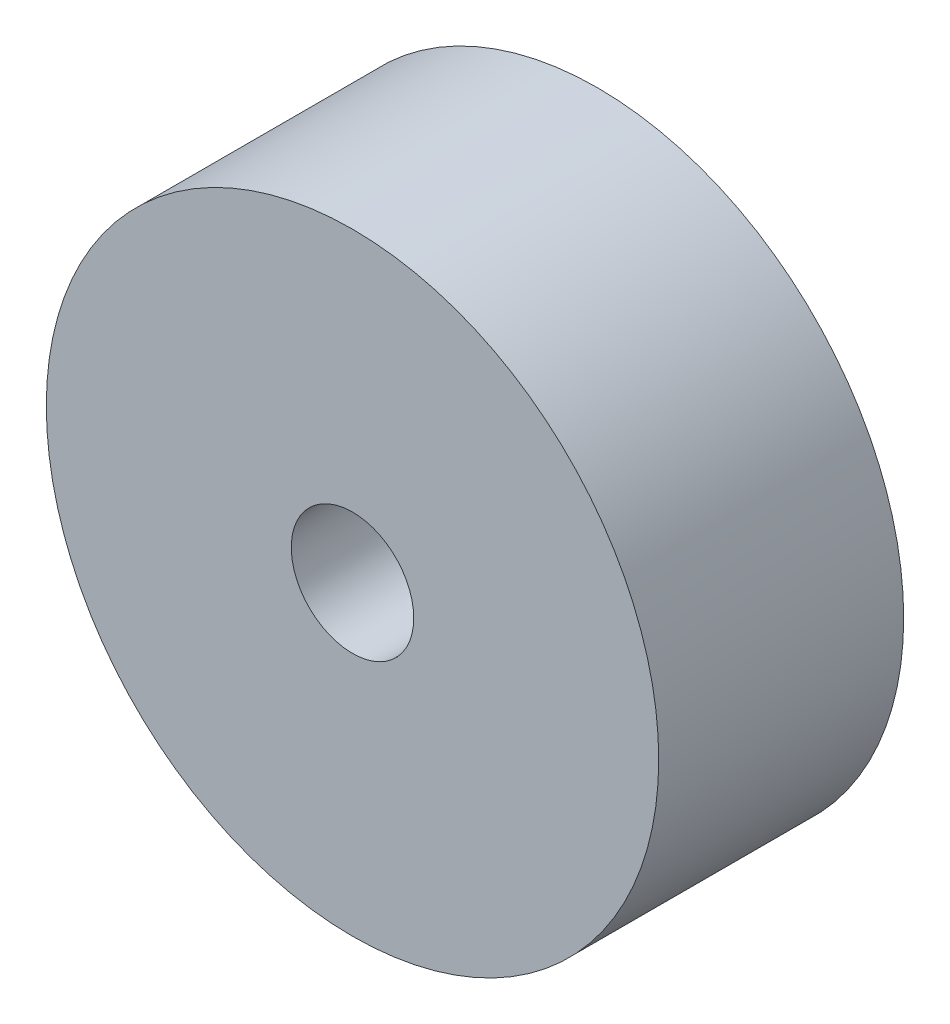
ISO-10303-21;
HEADER;
FILE_DESCRIPTION(('STEP AP214'),'2;1');
FILE_NAME('part.step','',(''),(''),'','','');
FILE_SCHEMA(('AUTOMOTIVE_DESIGN { 1 0 10303 214 1 1 1 1 }'));
ENDSEC;
DATA;
#1=APPLICATION_CONTEXT('core data for automotive mechanical design processes');
#2=APPLICATION_PROTOCOL_DEFINITION('international standard','automotive_design',2000,#1);
#3=PRODUCT_CONTEXT('',#1,'mechanical');
#4=PRODUCT('Part','Part','',(#3));
#5=PRODUCT_RELATED_PRODUCT_CATEGORY('part','',(#4));
#6=PRODUCT_DEFINITION_FORMATION('','',#4);
#7=PRODUCT_DEFINITION_CONTEXT('part definition',#1,'design');
#8=PRODUCT_DEFINITION('design','',#6,#7);
#9=PRODUCT_DEFINITION_SHAPE('','',#8);
#10=(LENGTH_UNIT() NAMED_UNIT(*) SI_UNIT(.MILLI.,.METRE.));
#11=(NAMED_UNIT(*) PLANE_ANGLE_UNIT() SI_UNIT($,.RADIAN.));
#12=(NAMED_UNIT(*) SI_UNIT($,.STERADIAN.) SOLID_ANGLE_UNIT());
#13=UNCERTAINTY_MEASURE_WITH_UNIT(LENGTH_MEASURE(1.E-05),#10,'distance_accuracy_value','');
#14=(GEOMETRIC_REPRESENTATION_CONTEXT(3) GLOBAL_UNCERTAINTY_ASSIGNED_CONTEXT((#13)) GLOBAL_UNIT_ASSIGNED_CONTEXT((#10,
#11,#12)) REPRESENTATION_CONTEXT('',''));
#15=CARTESIAN_POINT('',(0.,0.,0.));
#16=DIRECTION('',(0.,0.,1.));
#17=DIRECTION('',(1.,0.,0.));
#18=AXIS2_PLACEMENT_3D('',#15,#16,#17);
#19=CARTESIAN_POINT('',(50.,0.,16.5));
#20=DIRECTION('',(0.,0.,-1.));
#21=DIRECTION('',(-1.,0.,0.));
#22=AXIS2_PLACEMENT_3D('',#19,#20,#21);
#23=CYLINDRICAL_SURFACE('',#22,15.);
#24=CARTESIAN_POINT('',(50.,0.,16.5));
#25=DIRECTION('',(0.,0.,1.));
#26=DIRECTION('',(1.,0.,0.));
#27=AXIS2_PLACEMENT_3D('',#24,#25,#26);
#28=CIRCLE('',#27,15.);
#29=CARTESIAN_POINT('',(65.,0.,16.5));
#30=VERTEX_POINT('',#29);
#31=EDGE_CURVE('E10',#30,#30,#28,.T.);
#32=ORIENTED_EDGE('',*,*,#31,.F.);
#33=EDGE_LOOP('',(#32));
#34=FACE_BOUND('',#33,.T.);
#35=CARTESIAN_POINT('',(50.,0.,4.5));
#36=DIRECTION('',(0.,0.,1.));
#37=DIRECTION('',(1.,0.,0.));
#38=AXIS2_PLACEMENT_3D('',#35,#36,#37);
#39=CIRCLE('',#38,15.);
#40=CARTESIAN_POINT('',(65.,0.,4.5));
#41=VERTEX_POINT('',#40);
#42=EDGE_CURVE('E49',#41,#41,#39,.T.);
#43=ORIENTED_EDGE('',*,*,#42,.T.);
#44=EDGE_LOOP('',(#43));
#45=FACE_BOUND('',#44,.T.);
#46=ADVANCED_FACE('F41',(#34,#45),#23,.T.);
#47=CARTESIAN_POINT('',(50.,0.,16.5));
#48=DIRECTION('',(0.,0.,1.));
#49=DIRECTION('',(1.,0.,0.));
#50=AXIS2_PLACEMENT_3D('',#47,#48,#49);
#51=PLANE('',#50);
#52=CARTESIAN_POINT('',(50.,0.,16.5));
#53=DIRECTION('',(0.,0.,1.));
#54=DIRECTION('',(1.,0.,0.));
#55=AXIS2_PLACEMENT_3D('',#52,#53,#54);
#56=CIRCLE('',#55,3.);
#57=CARTESIAN_POINT('',(53.,0.,16.5));
#58=VERTEX_POINT('',#57);
#59=EDGE_CURVE('E56',#58,#58,#56,.T.);
#60=ORIENTED_EDGE('',*,*,#59,.F.);
#61=EDGE_LOOP('',(#60));
#62=FACE_BOUND('',#61,.T.);
#63=ORIENTED_EDGE('',*,*,#31,.T.);
#64=EDGE_LOOP('',(#63));
#65=FACE_BOUND('',#64,.T.);
#66=ADVANCED_FACE('F74',(#62,#65),#51,.T.);
#67=CARTESIAN_POINT('',(50.,0.,4.5));
#68=DIRECTION('',(0.,0.,1.));
#69=DIRECTION('',(1.,0.,0.));
#70=AXIS2_PLACEMENT_3D('',#67,#68,#69);
#71=PLANE('',#70);
#72=CARTESIAN_POINT('',(50.,0.,4.5));
#73=DIRECTION('',(0.,0.,1.));
#74=DIRECTION('',(1.,0.,0.));
#75=AXIS2_PLACEMENT_3D('',#72,#73,#74);
#76=CIRCLE('',#75,3.);
#77=CARTESIAN_POINT('',(53.,0.,4.5));
#78=VERTEX_POINT('',#77);
#79=EDGE_CURVE('E44',#78,#78,#76,.T.);
#80=ORIENTED_EDGE('',*,*,#79,.T.);
#81=EDGE_LOOP('',(#80));
#82=FACE_BOUND('',#81,.T.);
#83=ORIENTED_EDGE('',*,*,#42,.F.);
#84=EDGE_LOOP('',(#83));
#85=FACE_BOUND('',#84,.T.);
#86=ADVANCED_FACE('F65',(#82,#85),#71,.F.);
#87=CARTESIAN_POINT('',(50.,0.,-3.5));
#88=DIRECTION('',(0.,0.,1.));
#89=DIRECTION('',(1.,0.,0.));
#90=AXIS2_PLACEMENT_3D('',#87,#88,#89);
#91=CYLINDRICAL_SURFACE('',#90,3.);
#92=ORIENTED_EDGE('',*,*,#59,.T.);
#93=EDGE_LOOP('',(#92));
#94=FACE_BOUND('',#93,.T.);
#95=ORIENTED_EDGE('',*,*,#79,.F.);
#96=EDGE_LOOP('',(#95));
#97=FACE_BOUND('',#96,.T.);
#98=ADVANCED_FACE('F68',(#94,#97),#91,.F.);
#99=CLOSED_SHELL('',(#46,#66,#86,#98));
#100=MANIFOLD_SOLID_BREP('B2',#99);
#101=ADVANCED_BREP_SHAPE_REPRESENTATION('',(#18,#100),#14);
#102=SHAPE_DEFINITION_REPRESENTATION(#9,#101);
ENDSEC;
END-ISO-10303-21;
